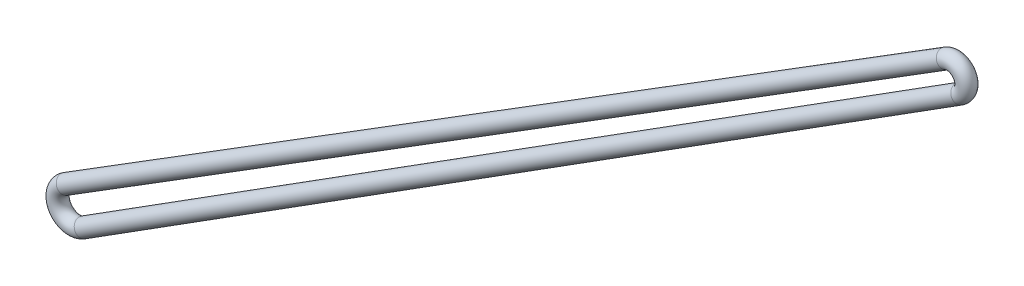
ISO-10303-21;
HEADER;
FILE_DESCRIPTION(('STEP AP214'),'2;1');
FILE_NAME('part.step','',(''),(''),'','','');
FILE_SCHEMA(('AUTOMOTIVE_DESIGN { 1 0 10303 214 1 1 1 1 }'));
ENDSEC;
DATA;
#1=APPLICATION_CONTEXT('core data for automotive mechanical design processes');
#2=APPLICATION_PROTOCOL_DEFINITION('international standard','automotive_design',2000,#1);
#3=PRODUCT_CONTEXT('',#1,'mechanical');
#4=PRODUCT('Part','Part','',(#3));
#5=PRODUCT_RELATED_PRODUCT_CATEGORY('part','',(#4));
#6=PRODUCT_DEFINITION_FORMATION('','',#4);
#7=PRODUCT_DEFINITION_CONTEXT('part definition',#1,'design');
#8=PRODUCT_DEFINITION('design','',#6,#7);
#9=PRODUCT_DEFINITION_SHAPE('','',#8);
#10=(LENGTH_UNIT() NAMED_UNIT(*) SI_UNIT(.MILLI.,.METRE.));
#11=(NAMED_UNIT(*) PLANE_ANGLE_UNIT() SI_UNIT($,.RADIAN.));
#12=(NAMED_UNIT(*) SI_UNIT($,.STERADIAN.) SOLID_ANGLE_UNIT());
#13=UNCERTAINTY_MEASURE_WITH_UNIT(LENGTH_MEASURE(1.E-05),#10,'distance_accuracy_value','');
#14=(GEOMETRIC_REPRESENTATION_CONTEXT(3) GLOBAL_UNCERTAINTY_ASSIGNED_CONTEXT((#13)) GLOBAL_UNIT_ASSIGNED_CONTEXT((#10,
#11,#12)) REPRESENTATION_CONTEXT('',''));
#15=CARTESIAN_POINT('',(0.,0.,0.));
#16=DIRECTION('',(0.,0.,1.));
#17=DIRECTION('',(1.,0.,0.));
#18=AXIS2_PLACEMENT_3D('',#15,#16,#17);
#19=CARTESIAN_POINT('',(160.920898694043,101.017148858494,0.));
#20=DIRECTION('',(0.,0.,-1.));
#21=DIRECTION('',(-1.,0.,0.));
#22=AXIS2_PLACEMENT_3D('',#19,#20,#21);
#23=TOROIDAL_SURFACE('',#22,2.49999999999999,1.5);
#24=CARTESIAN_POINT('',(159.598418774157,103.138715935327,0.));
#25=DIRECTION('',(-0.848626830732036,-0.528991967955753,0.));
#26=DIRECTION('',(0.528991967955753,-0.848626830732036,0.));
#27=AXIS2_PLACEMENT_3D('',#24,#25,#26);
#28=CIRCLE('',#27,1.5);
#29=CARTESIAN_POINT('',(158.804930822226,104.411656181426,0.));
#30=VERTEX_POINT('',#29);
#31=EDGE_CURVE('E60',#30,#30,#28,.T.);
#32=CARTESIAN_POINT('',(162.256751541805,98.9039765585798,0.));
#33=DIRECTION('',(0.845268919964845,0.534341139106344,0.));
#34=DIRECTION('',(-0.534341139106344,0.845268919964845,0.));
#35=AXIS2_PLACEMENT_3D('',#32,#33,#34);
#36=CIRCLE('',#35,1.5);
#37=CARTESIAN_POINT('',(163.058263250462,97.6360731786311,0.));
#38=VERTEX_POINT('',#37);
#39=EDGE_CURVE('E56',#38,#38,#36,.T.);
#40=CARTESIAN_POINT('',(160.920898694043,101.017148858494,0.));
#41=DIRECTION('',(0.,0.,-1.));
#42=DIRECTION('',(-1.,0.,0.));
#43=AXIS2_PLACEMENT_3D('',#40,#41,#42);
#44=CIRCLE('',#43,3.99999999999999);
#45=EDGE_CURVE('',#30,#38,#44,.T.);
#46=ORIENTED_EDGE('',*,*,#31,.F.);
#47=ORIENTED_EDGE('',*,*,#39,.T.);
#48=ORIENTED_EDGE('',*,*,#45,.T.);
#49=ORIENTED_EDGE('',*,*,#45,.F.);
#50=EDGE_LOOP('',(#46,#48,#47,#49));
#51=FACE_BOUND('',#50,.T.);
#52=ADVANCED_FACE('F45',(#51),#23,.T.);
#53=CARTESIAN_POINT('',(162.256751541805,98.9039765585797,0.));
#54=DIRECTION('',(-0.845268919966656,-0.534341139103478,0.));
#55=DIRECTION('',(0.534341139103478,-0.845268919966656,0.));
#56=AXIS2_PLACEMENT_3D('',#53,#54,#55);
#57=CYLINDRICAL_SURFACE('',#56,1.5);
#58=CARTESIAN_POINT('',(1.65645753122065,-2.62033365189672,0.));
#59=DIRECTION('',(0.84526891996575,0.534341139104912,0.));
#60=DIRECTION('',(-0.534341139104912,0.84526891996575,0.));
#61=AXIS2_PLACEMENT_3D('',#58,#59,#60);
#62=CIRCLE('',#61,1.5);
#63=CARTESIAN_POINT('',(2.45796923987579,-3.88823703184672,0.));
#64=VERTEX_POINT('',#63);
#65=EDGE_CURVE('E52',#64,#64,#62,.T.);
#66=ORIENTED_EDGE('',*,*,#65,.T.);
#67=EDGE_LOOP('',(#66));
#68=FACE_BOUND('',#67,.T.);
#69=ORIENTED_EDGE('',*,*,#39,.F.);
#70=EDGE_LOOP('',(#69));
#71=FACE_BOUND('',#70,.T.);
#72=ADVANCED_FACE('F69',(#68,#71),#57,.T.);
#73=CARTESIAN_POINT('',(0.,0.,0.));
#74=DIRECTION('',(0.,0.,-1.));
#75=DIRECTION('',(-1.,0.,0.));
#76=AXIS2_PLACEMENT_3D('',#73,#74,#75);
#77=TOROIDAL_SURFACE('',#76,3.09999999999997,1.5);
#78=CARTESIAN_POINT('',(-1.63987510048771,2.63074317499845,0.));
#79=DIRECTION('',(-0.848626830732036,-0.528991967955753,0.));
#80=DIRECTION('',(0.528991967955753,-0.848626830732036,0.));
#81=AXIS2_PLACEMENT_3D('',#78,#79,#80);
#82=CIRCLE('',#81,1.5);
#83=CARTESIAN_POINT('',(-2.43336305258974,3.90368342137152,0.));
#84=VERTEX_POINT('',#83);
#85=EDGE_CURVE('E11',#84,#84,#82,.T.);
#86=CARTESIAN_POINT('',(0.,0.,0.));
#87=DIRECTION('',(0.,0.,-1.));
#88=DIRECTION('',(-1.,0.,0.));
#89=AXIS2_PLACEMENT_3D('',#86,#87,#88);
#90=CIRCLE('',#89,4.59999999999997);
#91=EDGE_CURVE('',#64,#84,#90,.T.);
#92=ORIENTED_EDGE('',*,*,#65,.F.);
#93=ORIENTED_EDGE('',*,*,#85,.T.);
#94=ORIENTED_EDGE('',*,*,#91,.T.);
#95=ORIENTED_EDGE('',*,*,#91,.F.);
#96=EDGE_LOOP('',(#92,#94,#93,#95));
#97=FACE_BOUND('',#96,.T.);
#98=ADVANCED_FACE('F75',(#97),#77,.T.);
#99=CARTESIAN_POINT('',(-1.63987510048774,2.63074317499851,0.));
#100=DIRECTION('',(0.848626830732036,0.528991967955753,0.));
#101=DIRECTION('',(-0.528991967955753,0.848626830732036,0.));
#102=AXIS2_PLACEMENT_3D('',#99,#100,#101);
#103=CYLINDRICAL_SURFACE('',#102,1.5);
#104=ORIENTED_EDGE('',*,*,#31,.T.);
#105=EDGE_LOOP('',(#104));
#106=FACE_BOUND('',#105,.T.);
#107=ORIENTED_EDGE('',*,*,#85,.F.);
#108=EDGE_LOOP('',(#107));
#109=FACE_BOUND('',#108,.T.);
#110=ADVANCED_FACE('F47',(#106,#109),#103,.T.);
#111=CLOSED_SHELL('',(#52,#72,#98,#110));
#112=MANIFOLD_SOLID_BREP('B2',#111);
#113=ADVANCED_BREP_SHAPE_REPRESENTATION('',(#18,#112),#14);
#114=SHAPE_DEFINITION_REPRESENTATION(#9,#113);
ENDSEC;
END-ISO-10303-21;
